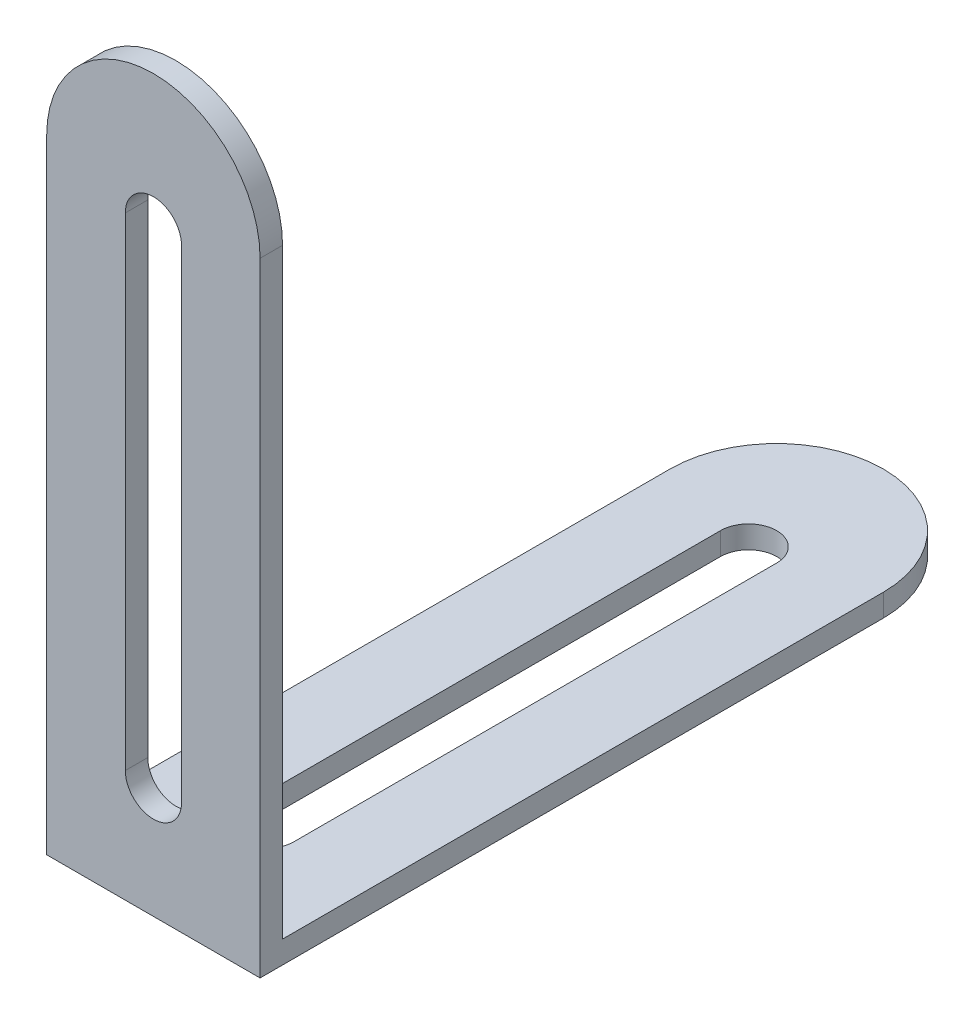
ISO-10303-21;
HEADER;
FILE_DESCRIPTION(('STEP AP214'),'2;1');
FILE_NAME('part.step','',(''),(''),'','','');
FILE_SCHEMA(('AUTOMOTIVE_DESIGN { 1 0 10303 214 1 1 1 1 }'));
ENDSEC;
DATA;
#1=APPLICATION_CONTEXT('core data for automotive mechanical design processes');
#2=APPLICATION_PROTOCOL_DEFINITION('international standard','automotive_design',2000,#1);
#3=PRODUCT_CONTEXT('',#1,'mechanical');
#4=PRODUCT('Part','Part','',(#3));
#5=PRODUCT_RELATED_PRODUCT_CATEGORY('part','',(#4));
#6=PRODUCT_DEFINITION_FORMATION('','',#4);
#7=PRODUCT_DEFINITION_CONTEXT('part definition',#1,'design');
#8=PRODUCT_DEFINITION('design','',#6,#7);
#9=PRODUCT_DEFINITION_SHAPE('','',#8);
#10=(LENGTH_UNIT() NAMED_UNIT(*) SI_UNIT(.MILLI.,.METRE.));
#11=(NAMED_UNIT(*) PLANE_ANGLE_UNIT() SI_UNIT($,.RADIAN.));
#12=(NAMED_UNIT(*) SI_UNIT($,.STERADIAN.) SOLID_ANGLE_UNIT());
#13=UNCERTAINTY_MEASURE_WITH_UNIT(LENGTH_MEASURE(1.E-05),#10,'distance_accuracy_value','');
#14=(GEOMETRIC_REPRESENTATION_CONTEXT(3) GLOBAL_UNCERTAINTY_ASSIGNED_CONTEXT((#13)) GLOBAL_UNIT_ASSIGNED_CONTEXT((#10,
#11,#12)) REPRESENTATION_CONTEXT('',''));
#15=CARTESIAN_POINT('',(0.,0.,0.));
#16=DIRECTION('',(0.,0.,1.));
#17=DIRECTION('',(1.,0.,0.));
#18=AXIS2_PLACEMENT_3D('',#15,#16,#17);
#19=CARTESIAN_POINT('',(9.5,0.,2.));
#20=DIRECTION('',(-1.,0.,0.));
#21=DIRECTION('',(0.,0.,1.));
#22=AXIS2_PLACEMENT_3D('',#19,#20,#21);
#23=PLANE('',#22);
#24=DIRECTION('',(0.,0.,-1.));
#25=VECTOR('',#24,1.);
#26=CARTESIAN_POINT('',(9.5,55.5,2.));
#27=LINE('',#26,#25);
#28=CARTESIAN_POINT('',(9.5,55.5,2.));
#29=VERTEX_POINT('',#28);
#30=CARTESIAN_POINT('',(9.5,55.5,0.));
#31=VERTEX_POINT('',#30);
#32=EDGE_CURVE('E50',#29,#31,#27,.T.);
#33=ORIENTED_EDGE('',*,*,#32,.F.);
#34=DIRECTION('',(0.,1.,0.));
#35=VECTOR('',#34,1.);
#36=CARTESIAN_POINT('',(9.5,0.,2.));
#37=LINE('',#36,#35);
#38=CARTESIAN_POINT('',(9.5,0.,2.));
#39=VERTEX_POINT('',#38);
#40=EDGE_CURVE('E133',#39,#29,#37,.T.);
#41=ORIENTED_EDGE('',*,*,#40,.F.);
#42=DIRECTION('',(0.,0.,-1.));
#43=VECTOR('',#42,1.);
#44=CARTESIAN_POINT('',(9.5,0.,2.));
#45=LINE('',#44,#43);
#46=CARTESIAN_POINT('',(9.5,0.,-53.5));
#47=VERTEX_POINT('',#46);
#48=EDGE_CURVE('E146',#39,#47,#45,.T.);
#49=ORIENTED_EDGE('',*,*,#48,.T.);
#50=DIRECTION('',(0.,-1.,0.));
#51=VECTOR('',#50,1.);
#52=CARTESIAN_POINT('',(9.5,2.,-53.5));
#53=LINE('',#52,#51);
#54=CARTESIAN_POINT('',(9.5,2.,-53.5));
#55=VERTEX_POINT('',#54);
#56=EDGE_CURVE('E191',#55,#47,#53,.T.);
#57=ORIENTED_EDGE('',*,*,#56,.F.);
#58=DIRECTION('',(0.,0.,-1.));
#59=VECTOR('',#58,1.);
#60=CARTESIAN_POINT('',(9.5,2.,2.));
#61=LINE('',#60,#59);
#62=CARTESIAN_POINT('',(9.5,2.,0.));
#63=VERTEX_POINT('',#62);
#64=EDGE_CURVE('E57',#63,#55,#61,.T.);
#65=ORIENTED_EDGE('',*,*,#64,.F.);
#66=DIRECTION('',(0.,1.,0.));
#67=VECTOR('',#66,1.);
#68=CARTESIAN_POINT('',(9.5,0.,0.));
#69=LINE('',#68,#67);
#70=EDGE_CURVE('E172',#63,#31,#69,.T.);
#71=ORIENTED_EDGE('',*,*,#70,.T.);
#72=EDGE_LOOP('',(#33,#41,#49,#57,#65,#71));
#73=FACE_BOUND('',#72,.T.);
#74=ADVANCED_FACE('F41',(#73),#23,.F.);
#75=CARTESIAN_POINT('',(0.,55.5,2.));
#76=DIRECTION('',(0.,0.,-1.));
#77=DIRECTION('',(-1.,0.,0.));
#78=AXIS2_PLACEMENT_3D('',#75,#76,#77);
#79=CYLINDRICAL_SURFACE('',#78,9.5);
#80=CARTESIAN_POINT('',(0.,55.5,0.));
#81=DIRECTION('',(0.,0.,1.));
#82=DIRECTION('',(1.,0.,0.));
#83=AXIS2_PLACEMENT_3D('',#80,#81,#82);
#84=CIRCLE('',#83,9.5);
#85=CARTESIAN_POINT('',(-9.5,55.5,0.));
#86=VERTEX_POINT('',#85);
#87=EDGE_CURVE('E140',#31,#86,#84,.T.);
#88=ORIENTED_EDGE('',*,*,#87,.T.);
#89=DIRECTION('',(0.,0.,-1.));
#90=VECTOR('',#89,1.);
#91=CARTESIAN_POINT('',(-9.5,55.5,2.));
#92=LINE('',#91,#90);
#93=CARTESIAN_POINT('',(-9.5,55.5,2.));
#94=VERTEX_POINT('',#93);
#95=EDGE_CURVE('E121',#94,#86,#92,.T.);
#96=ORIENTED_EDGE('',*,*,#95,.F.);
#97=CARTESIAN_POINT('',(0.,55.5,2.));
#98=DIRECTION('',(0.,0.,1.));
#99=DIRECTION('',(1.,0.,0.));
#100=AXIS2_PLACEMENT_3D('',#97,#98,#99);
#101=CIRCLE('',#100,9.5);
#102=EDGE_CURVE('E127',#29,#94,#101,.T.);
#103=ORIENTED_EDGE('',*,*,#102,.F.);
#104=ORIENTED_EDGE('',*,*,#32,.T.);
#105=EDGE_LOOP('',(#88,#96,#103,#104));
#106=FACE_BOUND('',#105,.T.);
#107=ADVANCED_FACE('F139',(#106),#79,.T.);
#108=CARTESIAN_POINT('',(-9.5,0.,2.));
#109=DIRECTION('',(-1.,0.,0.));
#110=DIRECTION('',(0.,0.,1.));
#111=AXIS2_PLACEMENT_3D('',#108,#109,#110);
#112=PLANE('',#111);
#113=DIRECTION('',(0.,1.,0.));
#114=VECTOR('',#113,1.);
#115=CARTESIAN_POINT('',(-9.5,0.,0.));
#116=LINE('',#115,#114);
#117=CARTESIAN_POINT('',(-9.5,2.,0.));
#118=VERTEX_POINT('',#117);
#119=EDGE_CURVE('E93',#118,#86,#116,.T.);
#120=ORIENTED_EDGE('',*,*,#119,.F.);
#121=DIRECTION('',(0.,0.,1.));
#122=VECTOR('',#121,1.);
#123=CARTESIAN_POINT('',(-9.5,2.,2.));
#124=LINE('',#123,#122);
#125=CARTESIAN_POINT('',(-9.5,2.,-53.5));
#126=VERTEX_POINT('',#125);
#127=EDGE_CURVE('E218',#126,#118,#124,.T.);
#128=ORIENTED_EDGE('',*,*,#127,.F.);
#129=DIRECTION('',(0.,-1.,0.));
#130=VECTOR('',#129,1.);
#131=CARTESIAN_POINT('',(-9.5,2.,-53.5));
#132=LINE('',#131,#130);
#133=CARTESIAN_POINT('',(-9.5,0.,-53.5));
#134=VERTEX_POINT('',#133);
#135=EDGE_CURVE('E210',#126,#134,#132,.T.);
#136=ORIENTED_EDGE('',*,*,#135,.T.);
#137=DIRECTION('',(0.,0.,-1.));
#138=VECTOR('',#137,1.);
#139=CARTESIAN_POINT('',(-9.5,0.,2.));
#140=LINE('',#139,#138);
#141=CARTESIAN_POINT('',(-9.5,0.,2.));
#142=VERTEX_POINT('',#141);
#143=EDGE_CURVE('E125',#142,#134,#140,.T.);
#144=ORIENTED_EDGE('',*,*,#143,.F.);
#145=DIRECTION('',(0.,1.,0.));
#146=VECTOR('',#145,1.);
#147=CARTESIAN_POINT('',(-9.5,0.,2.));
#148=LINE('',#147,#146);
#149=EDGE_CURVE('E117',#142,#94,#148,.T.);
#150=ORIENTED_EDGE('',*,*,#149,.T.);
#151=ORIENTED_EDGE('',*,*,#95,.T.);
#152=EDGE_LOOP('',(#120,#128,#136,#144,#150,#151));
#153=FACE_BOUND('',#152,.T.);
#154=ADVANCED_FACE('F119',(#153),#112,.T.);
#155=CARTESIAN_POINT('',(0.,10.,2.));
#156=DIRECTION('',(0.,0.,-1.));
#157=DIRECTION('',(-1.,0.,0.));
#158=AXIS2_PLACEMENT_3D('',#155,#156,#157);
#159=CYLINDRICAL_SURFACE('',#158,2.5);
#160=CARTESIAN_POINT('',(0.,10.,0.));
#161=DIRECTION('',(0.,0.,1.));
#162=DIRECTION('',(1.,0.,0.));
#163=AXIS2_PLACEMENT_3D('',#160,#161,#162);
#164=CIRCLE('',#163,2.5);
#165=CARTESIAN_POINT('',(-2.49999999999999,10.,0.));
#166=VERTEX_POINT('',#165);
#167=CARTESIAN_POINT('',(2.5,10.,0.));
#168=VERTEX_POINT('',#167);
#169=EDGE_CURVE('E187',#166,#168,#164,.T.);
#170=ORIENTED_EDGE('',*,*,#169,.F.);
#171=DIRECTION('',(0.,0.,-1.));
#172=VECTOR('',#171,1.);
#173=CARTESIAN_POINT('',(-2.49999999999999,10.,2.));
#174=LINE('',#173,#172);
#175=CARTESIAN_POINT('',(-2.49999999999999,10.,2.));
#176=VERTEX_POINT('',#175);
#177=EDGE_CURVE('E101',#176,#166,#174,.T.);
#178=ORIENTED_EDGE('',*,*,#177,.F.);
#179=CARTESIAN_POINT('',(0.,10.,2.));
#180=DIRECTION('',(0.,0.,1.));
#181=DIRECTION('',(1.,0.,0.));
#182=AXIS2_PLACEMENT_3D('',#179,#180,#181);
#183=CIRCLE('',#182,2.5);
#184=CARTESIAN_POINT('',(2.5,10.,2.));
#185=VERTEX_POINT('',#184);
#186=EDGE_CURVE('E169',#176,#185,#183,.T.);
#187=ORIENTED_EDGE('',*,*,#186,.T.);
#188=DIRECTION('',(0.,0.,-1.));
#189=VECTOR('',#188,1.);
#190=CARTESIAN_POINT('',(2.5,10.,2.));
#191=LINE('',#190,#189);
#192=EDGE_CURVE('E150',#185,#168,#191,.T.);
#193=ORIENTED_EDGE('',*,*,#192,.T.);
#194=EDGE_LOOP('',(#170,#178,#187,#193));
#195=FACE_BOUND('',#194,.T.);
#196=ADVANCED_FACE('F43',(#195),#159,.F.);
#197=CARTESIAN_POINT('',(-2.49999999999999,0.,2.));
#198=DIRECTION('',(1.,0.,0.));
#199=DIRECTION('',(0.,1.,0.));
#200=AXIS2_PLACEMENT_3D('',#197,#198,#199);
#201=PLANE('',#200);
#202=DIRECTION('',(0.,-1.,0.));
#203=VECTOR('',#202,1.);
#204=CARTESIAN_POINT('',(-2.49999999999999,0.,0.));
#205=LINE('',#204,#203);
#206=CARTESIAN_POINT('',(-2.5,53.,0.));
#207=VERTEX_POINT('',#206);
#208=EDGE_CURVE('E183',#207,#166,#205,.T.);
#209=ORIENTED_EDGE('',*,*,#208,.F.);
#210=DIRECTION('',(0.,0.,-1.));
#211=VECTOR('',#210,1.);
#212=CARTESIAN_POINT('',(-2.5,53.,2.));
#213=LINE('',#212,#211);
#214=CARTESIAN_POINT('',(-2.5,53.,2.));
#215=VERTEX_POINT('',#214);
#216=EDGE_CURVE('E156',#215,#207,#213,.T.);
#217=ORIENTED_EDGE('',*,*,#216,.F.);
#218=DIRECTION('',(0.,-1.,0.));
#219=VECTOR('',#218,1.);
#220=CARTESIAN_POINT('',(-2.49999999999999,0.,2.));
#221=LINE('',#220,#219);
#222=EDGE_CURVE('E203',#215,#176,#221,.T.);
#223=ORIENTED_EDGE('',*,*,#222,.T.);
#224=ORIENTED_EDGE('',*,*,#177,.T.);
#225=EDGE_LOOP('',(#209,#217,#223,#224));
#226=FACE_BOUND('',#225,.T.);
#227=ADVANCED_FACE('F344',(#226),#201,.T.);
#228=CARTESIAN_POINT('',(0.,53.,2.));
#229=DIRECTION('',(0.,0.,-1.));
#230=DIRECTION('',(-1.,0.,0.));
#231=AXIS2_PLACEMENT_3D('',#228,#229,#230);
#232=CYLINDRICAL_SURFACE('',#231,2.5);
#233=CARTESIAN_POINT('',(0.,53.,0.));
#234=DIRECTION('',(0.,0.,1.));
#235=DIRECTION('',(1.,0.,0.));
#236=AXIS2_PLACEMENT_3D('',#233,#234,#235);
#237=CIRCLE('',#236,2.5);
#238=CARTESIAN_POINT('',(2.5,53.,0.));
#239=VERTEX_POINT('',#238);
#240=EDGE_CURVE('E179',#239,#207,#237,.T.);
#241=ORIENTED_EDGE('',*,*,#240,.F.);
#242=DIRECTION('',(0.,0.,-1.));
#243=VECTOR('',#242,1.);
#244=CARTESIAN_POINT('',(2.5,53.,2.));
#245=LINE('',#244,#243);
#246=CARTESIAN_POINT('',(2.5,53.,2.));
#247=VERTEX_POINT('',#246);
#248=EDGE_CURVE('E153',#247,#239,#245,.T.);
#249=ORIENTED_EDGE('',*,*,#248,.F.);
#250=CARTESIAN_POINT('',(0.,53.,2.));
#251=DIRECTION('',(0.,0.,1.));
#252=DIRECTION('',(1.,0.,0.));
#253=AXIS2_PLACEMENT_3D('',#250,#251,#252);
#254=CIRCLE('',#253,2.5);
#255=EDGE_CURVE('E199',#247,#215,#254,.T.);
#256=ORIENTED_EDGE('',*,*,#255,.T.);
#257=ORIENTED_EDGE('',*,*,#216,.T.);
#258=EDGE_LOOP('',(#241,#249,#256,#257));
#259=FACE_BOUND('',#258,.T.);
#260=ADVANCED_FACE('F331',(#259),#232,.F.);
#261=CARTESIAN_POINT('',(2.5,0.,2.));
#262=DIRECTION('',(1.,0.,0.));
#263=DIRECTION('',(0.,1.,0.));
#264=AXIS2_PLACEMENT_3D('',#261,#262,#263);
#265=PLANE('',#264);
#266=DIRECTION('',(0.,-1.,0.));
#267=VECTOR('',#266,1.);
#268=CARTESIAN_POINT('',(2.5,0.,0.));
#269=LINE('',#268,#267);
#270=EDGE_CURVE('E175',#239,#168,#269,.T.);
#271=ORIENTED_EDGE('',*,*,#270,.T.);
#272=ORIENTED_EDGE('',*,*,#192,.F.);
#273=DIRECTION('',(0.,-1.,0.));
#274=VECTOR('',#273,1.);
#275=CARTESIAN_POINT('',(2.5,0.,2.));
#276=LINE('',#275,#274);
#277=EDGE_CURVE('E196',#247,#185,#276,.T.);
#278=ORIENTED_EDGE('',*,*,#277,.F.);
#279=ORIENTED_EDGE('',*,*,#248,.T.);
#280=EDGE_LOOP('',(#271,#272,#278,#279));
#281=FACE_BOUND('',#280,.T.);
#282=ADVANCED_FACE('F322',(#281),#265,.F.);
#283=CARTESIAN_POINT('',(0.,0.,2.));
#284=DIRECTION('',(0.,1.,0.));
#285=DIRECTION('',(0.,0.,1.));
#286=AXIS2_PLACEMENT_3D('',#283,#284,#285);
#287=PLANE('',#286);
#288=ORIENTED_EDGE('',*,*,#143,.T.);
#289=CARTESIAN_POINT('',(0.,0.,-53.5));
#290=DIRECTION('',(0.,1.,0.));
#291=DIRECTION('',(0.,0.,1.));
#292=AXIS2_PLACEMENT_3D('',#289,#290,#291);
#293=CIRCLE('',#292,9.5);
#294=EDGE_CURVE('E214',#47,#134,#293,.T.);
#295=ORIENTED_EDGE('',*,*,#294,.F.);
#296=ORIENTED_EDGE('',*,*,#48,.F.);
#297=DIRECTION('',(1.,0.,0.));
#298=VECTOR('',#297,1.);
#299=CARTESIAN_POINT('',(0.,0.,2.));
#300=LINE('',#299,#298);
#301=EDGE_CURVE('E66',#142,#39,#300,.T.);
#302=ORIENTED_EDGE('',*,*,#301,.F.);
#303=EDGE_LOOP('',(#288,#295,#296,#302));
#304=FACE_BOUND('',#303,.T.);
#305=CARTESIAN_POINT('',(0.,0.,-8.));
#306=DIRECTION('',(0.,1.,0.));
#307=DIRECTION('',(0.,0.,1.));
#308=AXIS2_PLACEMENT_3D('',#305,#306,#307);
#309=CIRCLE('',#308,2.5);
#310=CARTESIAN_POINT('',(-2.5,0.,-8.));
#311=VERTEX_POINT('',#310);
#312=CARTESIAN_POINT('',(2.5,0.,-8.));
#313=VERTEX_POINT('',#312);
#314=EDGE_CURVE('E257',#311,#313,#309,.T.);
#315=ORIENTED_EDGE('',*,*,#314,.T.);
#316=DIRECTION('',(0.,0.,-1.));
#317=VECTOR('',#316,1.);
#318=CARTESIAN_POINT('',(2.5,0.,-8.));
#319=LINE('',#318,#317);
#320=CARTESIAN_POINT('',(2.5,0.,-51.));
#321=VERTEX_POINT('',#320);
#322=EDGE_CURVE('E253',#313,#321,#319,.T.);
#323=ORIENTED_EDGE('',*,*,#322,.T.);
#324=CARTESIAN_POINT('',(0.,0.,-51.));
#325=DIRECTION('',(0.,1.,0.));
#326=DIRECTION('',(0.,0.,1.));
#327=AXIS2_PLACEMENT_3D('',#324,#325,#326);
#328=CIRCLE('',#327,2.5);
#329=CARTESIAN_POINT('',(-2.5,0.,-51.));
#330=VERTEX_POINT('',#329);
#331=EDGE_CURVE('E249',#321,#330,#328,.T.);
#332=ORIENTED_EDGE('',*,*,#331,.T.);
#333=DIRECTION('',(0.,0.,1.));
#334=VECTOR('',#333,1.);
#335=CARTESIAN_POINT('',(-2.5,0.,-8.));
#336=LINE('',#335,#334);
#337=EDGE_CURVE('E244',#330,#311,#336,.T.);
#338=ORIENTED_EDGE('',*,*,#337,.T.);
#339=EDGE_LOOP('',(#315,#323,#332,#338));
#340=FACE_BOUND('',#339,.T.);
#341=ADVANCED_FACE('F320',(#304,#340),#287,.F.);
#342=CARTESIAN_POINT('',(0.,0.,2.));
#343=DIRECTION('',(0.,0.,1.));
#344=DIRECTION('',(1.,0.,0.));
#345=AXIS2_PLACEMENT_3D('',#342,#343,#344);
#346=PLANE('',#345);
#347=ORIENTED_EDGE('',*,*,#102,.T.);
#348=ORIENTED_EDGE('',*,*,#149,.F.);
#349=ORIENTED_EDGE('',*,*,#301,.T.);
#350=ORIENTED_EDGE('',*,*,#40,.T.);
#351=EDGE_LOOP('',(#347,#348,#349,#350));
#352=FACE_BOUND('',#351,.T.);
#353=ORIENTED_EDGE('',*,*,#186,.F.);
#354=ORIENTED_EDGE('',*,*,#222,.F.);
#355=ORIENTED_EDGE('',*,*,#255,.F.);
#356=ORIENTED_EDGE('',*,*,#277,.T.);
#357=EDGE_LOOP('',(#353,#354,#355,#356));
#358=FACE_BOUND('',#357,.T.);
#359=ADVANCED_FACE('F130',(#352,#358),#346,.T.);
#360=CARTESIAN_POINT('',(0.,0.,0.));
#361=DIRECTION('',(0.,0.,1.));
#362=DIRECTION('',(1.,0.,0.));
#363=AXIS2_PLACEMENT_3D('',#360,#361,#362);
#364=PLANE('',#363);
#365=ORIENTED_EDGE('',*,*,#169,.T.);
#366=ORIENTED_EDGE('',*,*,#270,.F.);
#367=ORIENTED_EDGE('',*,*,#240,.T.);
#368=ORIENTED_EDGE('',*,*,#208,.T.);
#369=EDGE_LOOP('',(#365,#366,#367,#368));
#370=FACE_BOUND('',#369,.T.);
#371=ORIENTED_EDGE('',*,*,#70,.F.);
#372=DIRECTION('',(-1.,0.,0.));
#373=VECTOR('',#372,1.);
#374=CARTESIAN_POINT('',(0.,2.,0.));
#375=LINE('',#374,#373);
#376=EDGE_CURVE('E11',#63,#118,#375,.T.);
#377=ORIENTED_EDGE('',*,*,#376,.T.);
#378=ORIENTED_EDGE('',*,*,#119,.T.);
#379=ORIENTED_EDGE('',*,*,#87,.F.);
#380=EDGE_LOOP('',(#371,#377,#378,#379));
#381=FACE_BOUND('',#380,.T.);
#382=ADVANCED_FACE('F329',(#370,#381),#364,.F.);
#383=CARTESIAN_POINT('',(0.,2.,-53.5));
#384=DIRECTION('',(0.,1.,0.));
#385=DIRECTION('',(0.,0.,1.));
#386=AXIS2_PLACEMENT_3D('',#383,#384,#385);
#387=PLANE('',#386);
#388=DIRECTION('',(0.,0.,-1.));
#389=VECTOR('',#388,1.);
#390=CARTESIAN_POINT('',(2.5,2.,-8.));
#391=LINE('',#390,#389);
#392=CARTESIAN_POINT('',(2.5,2.,-8.));
#393=VERTEX_POINT('',#392);
#394=CARTESIAN_POINT('',(2.5,2.,-51.));
#395=VERTEX_POINT('',#394);
#396=EDGE_CURVE('E268',#393,#395,#391,.T.);
#397=ORIENTED_EDGE('',*,*,#396,.F.);
#398=CARTESIAN_POINT('',(0.,2.,-8.));
#399=DIRECTION('',(0.,1.,0.));
#400=DIRECTION('',(0.,0.,1.));
#401=AXIS2_PLACEMENT_3D('',#398,#399,#400);
#402=CIRCLE('',#401,2.5);
#403=CARTESIAN_POINT('',(-2.5,2.,-8.));
#404=VERTEX_POINT('',#403);
#405=EDGE_CURVE('E248',#404,#393,#402,.T.);
#406=ORIENTED_EDGE('',*,*,#405,.F.);
#407=DIRECTION('',(0.,0.,1.));
#408=VECTOR('',#407,1.);
#409=CARTESIAN_POINT('',(-2.5,2.,-8.));
#410=LINE('',#409,#408);
#411=CARTESIAN_POINT('',(-2.5,2.,-51.));
#412=VERTEX_POINT('',#411);
#413=EDGE_CURVE('E243',#412,#404,#410,.T.);
#414=ORIENTED_EDGE('',*,*,#413,.F.);
#415=CARTESIAN_POINT('',(0.,2.,-51.));
#416=DIRECTION('',(0.,1.,0.));
#417=DIRECTION('',(0.,0.,1.));
#418=AXIS2_PLACEMENT_3D('',#415,#416,#417);
#419=CIRCLE('',#418,2.5);
#420=EDGE_CURVE('E264',#395,#412,#419,.T.);
#421=ORIENTED_EDGE('',*,*,#420,.F.);
#422=EDGE_LOOP('',(#397,#406,#414,#421));
#423=FACE_BOUND('',#422,.T.);
#424=ORIENTED_EDGE('',*,*,#376,.F.);
#425=ORIENTED_EDGE('',*,*,#64,.T.);
#426=CARTESIAN_POINT('',(0.,2.,-53.5));
#427=DIRECTION('',(0.,1.,0.));
#428=DIRECTION('',(0.,0.,1.));
#429=AXIS2_PLACEMENT_3D('',#426,#427,#428);
#430=CIRCLE('',#429,9.5);
#431=EDGE_CURVE('E213',#55,#126,#430,.T.);
#432=ORIENTED_EDGE('',*,*,#431,.T.);
#433=ORIENTED_EDGE('',*,*,#127,.T.);
#434=EDGE_LOOP('',(#424,#425,#432,#433));
#435=FACE_BOUND('',#434,.T.);
#436=ADVANCED_FACE('F294',(#423,#435),#387,.T.);
#437=CARTESIAN_POINT('',(0.,2.,-53.5));
#438=DIRECTION('',(0.,-1.,0.));
#439=DIRECTION('',(0.,0.,-1.));
#440=AXIS2_PLACEMENT_3D('',#437,#438,#439);
#441=CYLINDRICAL_SURFACE('',#440,9.5);
#442=ORIENTED_EDGE('',*,*,#294,.T.);
#443=ORIENTED_EDGE('',*,*,#135,.F.);
#444=ORIENTED_EDGE('',*,*,#431,.F.);
#445=ORIENTED_EDGE('',*,*,#56,.T.);
#446=EDGE_LOOP('',(#442,#443,#444,#445));
#447=FACE_BOUND('',#446,.T.);
#448=ADVANCED_FACE('F363',(#447),#441,.T.);
#449=CARTESIAN_POINT('',(0.,2.,-8.));
#450=DIRECTION('',(0.,-1.,0.));
#451=DIRECTION('',(0.,0.,-1.));
#452=AXIS2_PLACEMENT_3D('',#449,#450,#451);
#453=CYLINDRICAL_SURFACE('',#452,2.5);
#454=ORIENTED_EDGE('',*,*,#314,.F.);
#455=DIRECTION('',(0.,-1.,0.));
#456=VECTOR('',#455,1.);
#457=CARTESIAN_POINT('',(-2.5,2.,-8.));
#458=LINE('',#457,#456);
#459=EDGE_CURVE('E239',#404,#311,#458,.T.);
#460=ORIENTED_EDGE('',*,*,#459,.F.);
#461=ORIENTED_EDGE('',*,*,#405,.T.);
#462=DIRECTION('',(0.,-1.,0.));
#463=VECTOR('',#462,1.);
#464=CARTESIAN_POINT('',(2.5,2.,-8.));
#465=LINE('',#464,#463);
#466=EDGE_CURVE('E219',#393,#313,#465,.T.);
#467=ORIENTED_EDGE('',*,*,#466,.T.);
#468=EDGE_LOOP('',(#454,#460,#461,#467));
#469=FACE_BOUND('',#468,.T.);
#470=ADVANCED_FACE('F280',(#469),#453,.F.);
#471=CARTESIAN_POINT('',(2.5,2.,-8.));
#472=DIRECTION('',(-1.,0.,0.));
#473=DIRECTION('',(0.,0.,1.));
#474=AXIS2_PLACEMENT_3D('',#471,#472,#473);
#475=PLANE('',#474);
#476=ORIENTED_EDGE('',*,*,#322,.F.);
#477=ORIENTED_EDGE('',*,*,#466,.F.);
#478=ORIENTED_EDGE('',*,*,#396,.T.);
#479=DIRECTION('',(0.,-1.,0.));
#480=VECTOR('',#479,1.);
#481=CARTESIAN_POINT('',(2.5,2.,-51.));
#482=LINE('',#481,#480);
#483=EDGE_CURVE('E231',#395,#321,#482,.T.);
#484=ORIENTED_EDGE('',*,*,#483,.T.);
#485=EDGE_LOOP('',(#476,#477,#478,#484));
#486=FACE_BOUND('',#485,.T.);
#487=ADVANCED_FACE('F291',(#486),#475,.T.);
#488=CARTESIAN_POINT('',(0.,2.,-51.));
#489=DIRECTION('',(0.,-1.,0.));
#490=DIRECTION('',(0.,0.,-1.));
#491=AXIS2_PLACEMENT_3D('',#488,#489,#490);
#492=CYLINDRICAL_SURFACE('',#491,2.5);
#493=ORIENTED_EDGE('',*,*,#331,.F.);
#494=ORIENTED_EDGE('',*,*,#483,.F.);
#495=ORIENTED_EDGE('',*,*,#420,.T.);
#496=DIRECTION('',(0.,-1.,0.));
#497=VECTOR('',#496,1.);
#498=CARTESIAN_POINT('',(-2.5,2.,-51.));
#499=LINE('',#498,#497);
#500=EDGE_CURVE('E235',#412,#330,#499,.T.);
#501=ORIENTED_EDGE('',*,*,#500,.T.);
#502=EDGE_LOOP('',(#493,#494,#495,#501));
#503=FACE_BOUND('',#502,.T.);
#504=ADVANCED_FACE('F300',(#503),#492,.F.);
#505=CARTESIAN_POINT('',(-2.5,2.,-8.));
#506=DIRECTION('',(1.,0.,0.));
#507=DIRECTION('',(0.,0.,-1.));
#508=AXIS2_PLACEMENT_3D('',#505,#506,#507);
#509=PLANE('',#508);
#510=ORIENTED_EDGE('',*,*,#337,.F.);
#511=ORIENTED_EDGE('',*,*,#500,.F.);
#512=ORIENTED_EDGE('',*,*,#413,.T.);
#513=ORIENTED_EDGE('',*,*,#459,.T.);
#514=EDGE_LOOP('',(#510,#511,#512,#513));
#515=FACE_BOUND('',#514,.T.);
#516=ADVANCED_FACE('F318',(#515),#509,.T.);
#517=CLOSED_SHELL('',(#74,#107,#154,#196,#227,#260,#282,#341,#359,#382,#436,#448,#470,#487,#504,#516));
#518=MANIFOLD_SOLID_BREP('B2',#517);
#519=ADVANCED_BREP_SHAPE_REPRESENTATION('',(#18,#518),#14);
#520=SHAPE_DEFINITION_REPRESENTATION(#9,#519);
ENDSEC;
END-ISO-10303-21;
